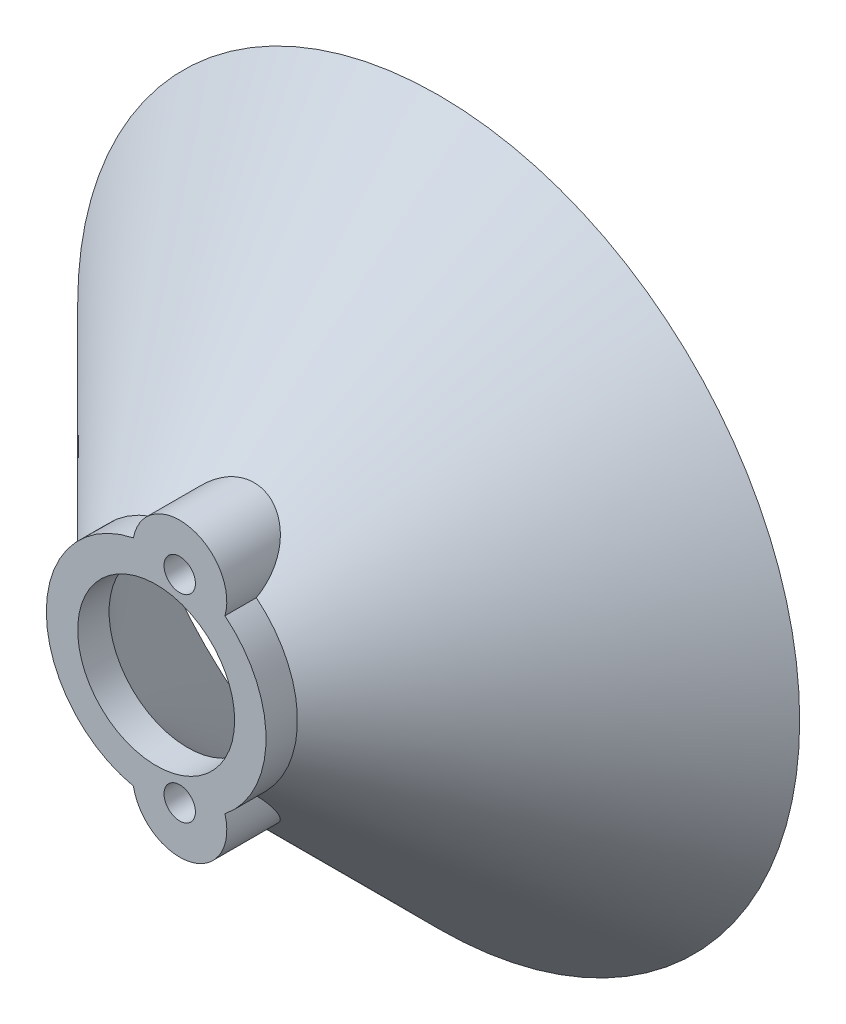
ISO-10303-21;
HEADER;
FILE_DESCRIPTION(('STEP AP214'),'2;1');
FILE_NAME('part.step','',(''),(''),'','','');
FILE_SCHEMA(('AUTOMOTIVE_DESIGN { 1 0 10303 214 1 1 1 1 }'));
ENDSEC;
DATA;
#1=APPLICATION_CONTEXT('core data for automotive mechanical design processes');
#2=APPLICATION_PROTOCOL_DEFINITION('international standard','automotive_design',2000,#1);
#3=PRODUCT_CONTEXT('',#1,'mechanical');
#4=PRODUCT('Part','Part','',(#3));
#5=PRODUCT_RELATED_PRODUCT_CATEGORY('part','',(#4));
#6=PRODUCT_DEFINITION_FORMATION('','',#4);
#7=PRODUCT_DEFINITION_CONTEXT('part definition',#1,'design');
#8=PRODUCT_DEFINITION('design','',#6,#7);
#9=PRODUCT_DEFINITION_SHAPE('','',#8);
#10=(LENGTH_UNIT() NAMED_UNIT(*) SI_UNIT(.MILLI.,.METRE.));
#11=(NAMED_UNIT(*) PLANE_ANGLE_UNIT() SI_UNIT($,.RADIAN.));
#12=(NAMED_UNIT(*) SI_UNIT($,.STERADIAN.) SOLID_ANGLE_UNIT());
#13=UNCERTAINTY_MEASURE_WITH_UNIT(LENGTH_MEASURE(1.E-05),#10,'distance_accuracy_value','');
#14=(GEOMETRIC_REPRESENTATION_CONTEXT(3) GLOBAL_UNCERTAINTY_ASSIGNED_CONTEXT((#13)) GLOBAL_UNIT_ASSIGNED_CONTEXT((#10,
#11,#12)) REPRESENTATION_CONTEXT('',''));
#15=CARTESIAN_POINT('',(0.,0.,0.));
#16=DIRECTION('',(0.,0.,1.));
#17=DIRECTION('',(1.,0.,0.));
#18=AXIS2_PLACEMENT_3D('',#15,#16,#17);
#19=CARTESIAN_POINT('',(0.,0.,0.));
#20=DIRECTION('',(0.,0.,-1.));
#21=DIRECTION('',(-1.,0.,0.));
#22=AXIS2_PLACEMENT_3D('',#19,#20,#21);
#23=CONICAL_SURFACE('',#22,7.,0.78539816339745);
#24=CARTESIAN_POINT('',(0.,0.,-16.));
#25=DIRECTION('',(0.,0.,-1.));
#26=DIRECTION('',(-1.,0.,0.));
#27=AXIS2_PLACEMENT_3D('',#24,#25,#26);
#28=CIRCLE('',#27,23.0000000000001);
#29=CARTESIAN_POINT('',(-23.0000000000001,0.,-16.));
#30=VERTEX_POINT('',#29);
#31=EDGE_CURVE('E102',#30,#30,#28,.T.);
#32=ORIENTED_EDGE('',*,*,#31,.F.);
#33=EDGE_LOOP('',(#32));
#34=FACE_BOUND('',#33,.T.);
#35=CARTESIAN_POINT('',(4.38002597349473,-5.46008905710443,0.000200000000000384));
#36=CARTESIAN_POINT('',(4.40600004241989,-5.54920340052367,-0.0855735072586875));
#37=CARTESIAN_POINT('',(4.42804720668429,-5.64015158060134,-0.170573019301104));
#38=CARTESIAN_POINT('',(4.46373156243864,-5.82541331378191,-0.338834548684181));
#39=CARTESIAN_POINT('',(4.47736020927237,-5.91973018370654,-0.422094718102266));
#40=CARTESIAN_POINT('',(4.50483032614621,-6.20821871731188,-0.669766796828437));
#41=CARTESIAN_POINT('',(4.50491016461,-6.40678511714898,-0.830972203219254));
#42=CARTESIAN_POINT('',(4.46657070170104,-6.77833912474665,-1.11689781061202));
#43=CARTESIAN_POINT('',(4.43407197051871,-6.95056258230079,-1.24341577278359));
#44=CARTESIAN_POINT('',(4.33622760977159,-7.29371341657828,-1.48433222475109));
#45=CARTESIAN_POINT('',(4.27098547345163,-7.46464316515868,-1.59876753377278));
#46=CARTESIAN_POINT('',(4.12011987313716,-7.7691888413267,-1.79317153275031));
#47=CARTESIAN_POINT('',(4.04019795731339,-7.90402735788128,-1.87564856951719));
#48=CARTESIAN_POINT('',(3.85583362622914,-8.16423945592623,-2.02788497016604));
#49=CARTESIAN_POINT('',(3.75138542533433,-8.28961079491795,-2.09764132639132));
#50=CARTESIAN_POINT('',(3.57661134385553,-8.46672109107776,-2.19083795873603));
#51=CARTESIAN_POINT('',(3.51501332465714,-8.52417001946999,-2.22010410686948));
#52=CARTESIAN_POINT('',(3.38610587234105,-8.63447769938692,-2.27434472781031));
#53=CARTESIAN_POINT('',(3.31879952176245,-8.68733889750408,-2.29932149514647));
#54=CARTESIAN_POINT('',(3.17889681833493,-8.78771190510562,-2.34464423629331));
#55=CARTESIAN_POINT('',(3.10630343953184,-8.83522668433991,-2.36499278739758));
#56=CARTESIAN_POINT('',(2.95639904464545,-8.92421645310571,-2.40077876534268));
#57=CARTESIAN_POINT('',(2.87908890558933,-8.96569256063118,-2.41621710188451));
#58=CARTESIAN_POINT('',(2.66343950837689,-9.06932965289546,-2.45115778519646));
#59=CARTESIAN_POINT('',(2.52105506908791,-9.12502388576103,-2.46564881276383));
#60=CARTESIAN_POINT('',(2.22890132845023,-9.21410954968719,-2.47863531086376));
#61=CARTESIAN_POINT('',(2.0791361088564,-9.24751316263255,-2.47713952585163));
#62=CARTESIAN_POINT('',(1.78976111685691,-9.28925137819928,-2.45906527162721));
#63=CARTESIAN_POINT('',(1.65033309070723,-9.29942713131322,-2.44374154791665));
#64=CARTESIAN_POINT('',(1.37343211126622,-9.30052580312172,-2.4003929548129));
#65=CARTESIAN_POINT('',(1.23595913795875,-9.29144891907078,-2.37236821555132));
#66=CARTESIAN_POINT('',(0.963105849150731,-9.25485367562386,-2.30385237811956));
#67=CARTESIAN_POINT('',(0.827859131005005,-9.22688933777565,-2.2630729159767));
#68=CARTESIAN_POINT('',(0.565903724817107,-9.15411423013197,-2.17069682977966));
#69=CARTESIAN_POINT('',(0.439198035716614,-9.10929757908265,-2.11909643213356));
#70=CARTESIAN_POINT('',(0.183038793061871,-8.99946382533734,-2.00034739921533));
#71=CARTESIAN_POINT('',(0.0548124958313647,-8.9327684451456,-1.93211342821813));
#72=CARTESIAN_POINT('',(-0.186866027815897,-8.78487170433603,-1.78601882591699));
#73=CARTESIAN_POINT('',(-0.300311747484901,-8.70366399211608,-1.70815398408929));
#74=CARTESIAN_POINT('',(-0.529508925353116,-8.5151030087253,-1.53058702217918));
#75=CARTESIAN_POINT('',(-0.642393346876825,-8.40565112725254,-1.42942037522782));
#76=CARTESIAN_POINT('',(-0.846543799339141,-8.17548481184044,-1.21843242396596));
#77=CARTESIAN_POINT('',(-0.937789542067368,-8.05475995509113,-1.10860312517311));
#78=CARTESIAN_POINT('',(-1.11551994199878,-7.78020343155664,-0.858918690071136));
#79=CARTESIAN_POINT('',(-1.19718782305958,-7.62466072336668,-0.717526023537838));
#80=CARTESIAN_POINT('',(-1.33080994336098,-7.30798599419755,-0.427595657233578));
#81=CARTESIAN_POINT('',(-1.38278848964671,-7.14685866040406,-0.27906391065735));
#82=CARTESIAN_POINT('',(-1.43144177887967,-6.9394076476627,-0.085481475619611));
#83=CARTESIAN_POINT('',(-1.44102423021849,-6.89374547135443,-0.0427271057538026));
#84=CARTESIAN_POINT('',(-1.44951095060491,-6.84807403903291,0.000199999999995933));
#85=B_SPLINE_CURVE_WITH_KNOTS('',3,(#35,#36,#37,#38,#39,#40,#41,#42,#43,#44,#45,#46,#47,#48,#49,
#50,#51,#52,#53,#54,#55,#56,#57,#58,#59,#60,#61,#62,#63,#64,#65,#66,#67,#68,#69,#70,#71,#72,#73,
#74,#75,#76,#77,#78,#79,#80,#81,#82,#83,#84),.UNSPECIFIED.,.F.,.F.,(4,2,2,2,2,2,2,2,2,2,2,2,2,2,
2,2,2,2,2,2,2,2,2,2,4),(0.,0.378981692897977,0.758347416609259,1.52189881712999,
2.16799039121961,2.81205258173702,3.34137513139237,3.87082267138723,4.13799517974665,
4.40502432066171,4.67190439621682,4.93873499884537,5.39671380462983,5.85444211831994,
6.27440057932098,6.69435473762349,7.12458868870498,7.55497292580066,8.03263742434803,
8.51051149628236,9.06936586228223,9.62874215110698,10.3028721451866,10.9764494262305,
11.1662508129107),.UNSPECIFIED.);
#86=CARTESIAN_POINT('',(4.38008656456496,-5.46029684970675,0.));
#87=VERTEX_POINT('',#86);
#88=CARTESIAN_POINT('',(-1.44947140004422,-6.84828684128037,0.));
#89=VERTEX_POINT('',#88);
#90=EDGE_CURVE('E96',#87,#89,#85,.T.);
#91=ORIENTED_EDGE('',*,*,#90,.T.);
#92=CARTESIAN_POINT('',(0.,0.,0.));
#93=DIRECTION('',(0.,0.,1.));
#94=DIRECTION('',(1.,0.,0.));
#95=AXIS2_PLACEMENT_3D('',#92,#93,#94);
#96=CIRCLE('',#95,7.);
#97=CARTESIAN_POINT('',(-1.44947140004422,6.84828684128037,0.));
#98=VERTEX_POINT('',#97);
#99=EDGE_CURVE('E101',#98,#89,#96,.T.);
#100=ORIENTED_EDGE('',*,*,#99,.F.);
#101=CARTESIAN_POINT('',(-1.46068853435402,5.81593037428005,1.00344623030309));
#102=CARTESIAN_POINT('',(-1.47439258893566,5.89980230451008,0.918754293343235));
#103=CARTESIAN_POINT('',(-1.48457107664434,5.98438697027109,0.834234476532002));
#104=CARTESIAN_POINT('',(-1.49769797558791,6.15468245102708,0.665728119425346));
#105=CARTESIAN_POINT('',(-1.50064453606695,6.24039354865158,0.581741721123194));
#106=CARTESIAN_POINT('',(-1.49835350226193,6.49942447887601,0.330230025445846));
#107=CARTESIAN_POINT('',(-1.48186689806502,6.67393284776749,0.163866411539599));
#108=CARTESIAN_POINT('',(-1.4154360877965,7.03146651143603,-0.17216121817867));
#109=CARTESIAN_POINT('',(-1.36376097067543,7.21445175718274,-0.341531043027554));
#110=CARTESIAN_POINT('',(-1.22295331597393,7.57384065922986,-0.671286259634839));
#111=CARTESIAN_POINT('',(-1.13387623059536,7.75025363973727,-0.831684555268082));
#112=CARTESIAN_POINT('',(-0.932816312805183,8.06370721455375,-1.1167380830692));
#113=CARTESIAN_POINT('',(-0.826321288113327,8.20267120676445,-1.24313378762426));
#114=CARTESIAN_POINT('',(-0.584396116892566,8.4649536698036,-1.48408482404702));
#115=CARTESIAN_POINT('',(-0.448993718560591,8.58828696488269,-1.59865135537137));
#116=CARTESIAN_POINT('',(-0.176881093347268,8.79231258803561,-1.79319185777498));
#117=CARTESIAN_POINT('',(-0.0447361057830059,8.8766861460113,-1.87568800932243));
#118=CARTESIAN_POINT('',(0.237117971896833,9.02588685765781,-2.02791863530474));
#119=CARTESIAN_POINT('',(0.386822795027332,9.09071874628065,-2.09765619953672));
#120=CARTESIAN_POINT('',(0.622616776333805,9.17005102231931,-2.19083650385061));
#121=CARTESIAN_POINT('',(0.703490802948499,9.19357622438534,-2.22010142457082));
#122=CARTESIAN_POINT('',(0.868268688094588,9.23395576285823,-2.27433998430051));
#123=CARTESIAN_POINT('',(0.952170898837717,9.25081366929214,-2.29931591579964));
#124=CARTESIAN_POINT('',(1.12229464408929,9.27737205521736,-2.34463949696494));
#125=CARTESIAN_POINT('',(1.20851507579307,9.28707587766781,-2.36498930524657));
#126=CARTESIAN_POINT('',(1.3824457740388,9.29896513194352,-2.40077736020406));
#127=CARTESIAN_POINT('',(1.47015576145197,9.30115195709667,-2.416216516622));
#128=CARTESIAN_POINT('',(1.70937499840626,9.29648803662721,-2.45115789677618));
#129=CARTESIAN_POINT('',(1.86158117032906,9.28204169962075,-2.46564895848012));
#130=CARTESIAN_POINT('',(2.16253380738596,9.22991131908573,-2.47863529656449));
#131=CARTESIAN_POINT('',(2.31128215244337,9.1922402240667,-2.47713947853104));
#132=CARTESIAN_POINT('',(2.58841671405525,9.09909527813799,-2.4590652680131));
#133=CARTESIAN_POINT('',(2.71747034225015,9.04534681495937,-2.44374153571449));
#134=CARTESIAN_POINT('',(2.96515601829704,8.92154388729629,-2.4003929325333));
#135=CARTESIAN_POINT('',(3.08378818116866,8.85148960280709,-2.37236820185015));
#136=CARTESIAN_POINT('',(3.31087380079483,8.69586135203315,-2.30385240908336));
#137=CARTESIAN_POINT('',(3.41900702415282,8.60994947116486,-2.26307298924421));
#138=CARTESIAN_POINT('',(3.6200600037911,8.42693429555101,-2.17069692041721));
#139=CARTESIAN_POINT('',(3.71297440556866,8.32982708229089,-2.11909647872136));
#140=CARTESIAN_POINT('',(3.89215317271071,8.11634112896855,-2.00034724312917));
#141=CARTESIAN_POINT('',(3.97656562066453,7.99901722268328,-1.93211309364306));
#142=CARTESIAN_POINT('',(4.12566411463988,7.75807823906366,-1.78601841189554));
#143=CARTESIAN_POINT('',(4.19034159076706,7.63446045573037,-1.70815371814611));
#144=CARTESIAN_POINT('',(4.309972101223,7.36284726483827,-1.53058822541584));
#145=CARTESIAN_POINT('',(4.36142026976304,7.21427051885659,-1.42942304446289));
#146=CARTESIAN_POINT('',(4.43994352703065,6.91680040232332,-1.21843477661552));
#147=CARTESIAN_POINT('',(4.46699522687155,6.76790686481391,-1.10860349097039));
#148=CARTESIAN_POINT('',(4.50193071322984,6.44270732297609,-0.858912462604447));
#149=CARTESIAN_POINT('',(4.50474227010162,6.26704564288345,-0.71751550451562));
#150=CARTESIAN_POINT('',(4.48131286834933,5.92412198027988,-0.427574622868321));
#151=CARTESIAN_POINT('',(4.45509887989909,5.75685235082999,-0.279037456488061));
#152=CARTESIAN_POINT('',(4.4050570904833,5.54977458108781,-0.0854890951682216));
#153=CARTESIAN_POINT('',(4.39303770265286,5.50470540318252,-0.0427448771831622));
#154=CARTESIAN_POINT('',(4.34699937234609,5.34684305855434,0.109203447123938));
#155=CARTESIAN_POINT('',(4.30758882524441,5.23655830832694,0.21945943509701));
#156=CARTESIAN_POINT('',(4.21699869201045,5.02272966460625,0.441815660450446));
#157=CARTESIAN_POINT('',(4.16580721991221,4.91919271537603,0.55391765352031));
#158=CARTESIAN_POINT('',(4.05200738181153,4.71864385770806,0.780366028718059));
#159=CARTESIAN_POINT('',(3.98929411420278,4.62170414568599,0.894723625812897));
#160=CARTESIAN_POINT('',(3.85357805000762,4.43617935126151,1.12379495991822));
#161=CARTESIAN_POINT('',(3.78058958993838,4.34758291052815,1.23850798654678));
#162=CARTESIAN_POINT('',(3.70277215392269,4.26338642892089,1.35314375371913));
#163=B_SPLINE_CURVE_WITH_KNOTS('',3,(#101,#102,#103,#104,#105,#106,#107,#108,#109,#110,#111,
#112,#113,#114,#115,#116,#117,#118,#119,#120,#121,#122,#123,#124,#125,#126,#127,#128,#129,#130,
#131,#132,#133,#134,#135,#136,#137,#138,#139,#140,#141,#142,#143,#144,#145,#146,#147,#148,#149,
#150,#151,#152,#153,#154,#155,#156,#157,#158,#159,#160,#161,#162),.UNSPECIFIED.,.F.,.F.,(4,2,2,
2,2,2,2,2,2,2,2,2,2,2,2,2,2,2,2,2,2,2,2,2,2,2,2,2,2,2,4),(0.,0.359827111436056,
0.719746298290435,1.44260385671945,2.20386334892954,2.9639981600687,3.60938324247208,
4.25415158279092,4.78360085002196,5.3129217282307,5.58008203778968,5.84709910111127,
6.11399131352523,6.38083405293747,6.83881516663828,7.29654117254867,7.71649979997773,
8.13645379182483,8.56668736233241,8.99707198010078,9.474737699315,9.95261055021539,
10.5114582789765,11.0708412070828,11.7450077901627,12.4185484713751,12.6083388077533,
13.0901853022959,13.5725200875294,14.0594860832427,14.545779249703),.UNSPECIFIED.);
#164=CARTESIAN_POINT('',(4.38008656456496,5.46029684970676,0.));
#165=VERTEX_POINT('',#164);
#166=EDGE_CURVE('E99',#98,#165,#163,.T.);
#167=ORIENTED_EDGE('',*,*,#166,.T.);
#168=CARTESIAN_POINT('',(0.,0.,0.));
#169=DIRECTION('',(0.,0.,1.));
#170=DIRECTION('',(1.,0.,0.));
#171=AXIS2_PLACEMENT_3D('',#168,#169,#170);
#172=CIRCLE('',#171,7.);
#173=EDGE_CURVE('E87',#87,#165,#172,.T.);
#174=ORIENTED_EDGE('',*,*,#173,.F.);
#175=EDGE_LOOP('',(#91,#100,#167,#174));
#176=FACE_BOUND('',#175,.T.);
#177=ADVANCED_FACE('F47',(#34,#176),#23,.T.);
#178=CARTESIAN_POINT('',(1.5,-6.3,2.));
#179=DIRECTION('',(0.,0.,-1.));
#180=DIRECTION('',(-1.,0.,0.));
#181=AXIS2_PLACEMENT_3D('',#178,#179,#180);
#182=CYLINDRICAL_SURFACE('',#181,3.);
#183=DIRECTION('',(0.,0.,-1.));
#184=VECTOR('',#183,1.);
#185=CARTESIAN_POINT('',(-1.44947140004422,-6.84828684128037,2.));
#186=LINE('',#185,#184);
#187=CARTESIAN_POINT('',(-1.44947140004422,-6.84828684128037,2.));
#188=VERTEX_POINT('',#187);
#189=EDGE_CURVE('E105',#188,#89,#186,.T.);
#190=ORIENTED_EDGE('',*,*,#189,.T.);
#191=ORIENTED_EDGE('',*,*,#90,.F.);
#192=DIRECTION('',(0.,0.,-1.));
#193=VECTOR('',#192,1.);
#194=CARTESIAN_POINT('',(4.38008656456496,-5.46029684970675,2.));
#195=LINE('',#194,#193);
#196=CARTESIAN_POINT('',(4.38008656456496,-5.46029684970675,2.));
#197=VERTEX_POINT('',#196);
#198=EDGE_CURVE('E11',#197,#87,#195,.T.);
#199=ORIENTED_EDGE('',*,*,#198,.F.);
#200=CARTESIAN_POINT('',(1.5,-6.3,2.));
#201=DIRECTION('',(0.,0.,1.));
#202=DIRECTION('',(1.,0.,0.));
#203=AXIS2_PLACEMENT_3D('',#200,#201,#202);
#204=CIRCLE('',#203,3.);
#205=EDGE_CURVE('E289',#188,#197,#204,.T.);
#206=ORIENTED_EDGE('',*,*,#205,.F.);
#207=EDGE_LOOP('',(#190,#191,#199,#206));
#208=FACE_BOUND('',#207,.T.);
#209=ADVANCED_FACE('F49',(#208),#182,.T.);
#210=CARTESIAN_POINT('',(0.,0.,2.));
#211=DIRECTION('',(0.,0.,-1.));
#212=DIRECTION('',(-1.,0.,0.));
#213=AXIS2_PLACEMENT_3D('',#210,#211,#212);
#214=CYLINDRICAL_SURFACE('',#213,7.);
#215=ORIENTED_EDGE('',*,*,#173,.T.);
#216=DIRECTION('',(0.,0.,-1.));
#217=VECTOR('',#216,1.);
#218=CARTESIAN_POINT('',(4.38008656456496,5.46029684970676,2.));
#219=LINE('',#218,#217);
#220=CARTESIAN_POINT('',(4.38008656456496,5.46029684970676,2.));
#221=VERTEX_POINT('',#220);
#222=EDGE_CURVE('E57',#221,#165,#219,.T.);
#223=ORIENTED_EDGE('',*,*,#222,.F.);
#224=CARTESIAN_POINT('',(0.,0.,2.));
#225=DIRECTION('',(0.,0.,1.));
#226=DIRECTION('',(1.,0.,0.));
#227=AXIS2_PLACEMENT_3D('',#224,#225,#226);
#228=CIRCLE('',#227,7.);
#229=EDGE_CURVE('E89',#197,#221,#228,.T.);
#230=ORIENTED_EDGE('',*,*,#229,.F.);
#231=ORIENTED_EDGE('',*,*,#198,.T.);
#232=EDGE_LOOP('',(#215,#223,#230,#231));
#233=FACE_BOUND('',#232,.T.);
#234=ADVANCED_FACE('F85',(#233),#214,.T.);
#235=CARTESIAN_POINT('',(1.5,6.3,2.));
#236=DIRECTION('',(0.,0.,-1.));
#237=DIRECTION('',(-1.,0.,0.));
#238=AXIS2_PLACEMENT_3D('',#235,#236,#237);
#239=CYLINDRICAL_SURFACE('',#238,3.);
#240=ORIENTED_EDGE('',*,*,#222,.T.);
#241=ORIENTED_EDGE('',*,*,#166,.F.);
#242=DIRECTION('',(0.,0.,-1.));
#243=VECTOR('',#242,1.);
#244=CARTESIAN_POINT('',(-1.44947140004422,6.84828684128037,2.));
#245=LINE('',#244,#243);
#246=CARTESIAN_POINT('',(-1.44947140004422,6.84828684128037,2.));
#247=VERTEX_POINT('',#246);
#248=EDGE_CURVE('E301',#247,#98,#245,.T.);
#249=ORIENTED_EDGE('',*,*,#248,.F.);
#250=CARTESIAN_POINT('',(1.5,6.3,2.));
#251=DIRECTION('',(0.,0.,1.));
#252=DIRECTION('',(1.,0.,0.));
#253=AXIS2_PLACEMENT_3D('',#250,#251,#252);
#254=CIRCLE('',#253,3.);
#255=EDGE_CURVE('E307',#221,#247,#254,.T.);
#256=ORIENTED_EDGE('',*,*,#255,.F.);
#257=EDGE_LOOP('',(#240,#241,#249,#256));
#258=FACE_BOUND('',#257,.T.);
#259=ADVANCED_FACE('F160',(#258),#239,.T.);
#260=CARTESIAN_POINT('',(1.5,-6.3,2.));
#261=DIRECTION('',(0.,0.,-1.));
#262=DIRECTION('',(-1.,0.,0.));
#263=AXIS2_PLACEMENT_3D('',#260,#261,#262);
#264=CYLINDRICAL_SURFACE('',#263,1.);
#265=CARTESIAN_POINT('',(1.5,-6.3,0.));
#266=DIRECTION('',(0.,0.,1.));
#267=DIRECTION('',(1.,0.,0.));
#268=AXIS2_PLACEMENT_3D('',#265,#266,#267);
#269=CIRCLE('',#268,1.);
#270=CARTESIAN_POINT('',(2.5,-6.3,0.));
#271=VERTEX_POINT('',#270);
#272=EDGE_CURVE('E290',#271,#271,#269,.T.);
#273=ORIENTED_EDGE('',*,*,#272,.F.);
#274=EDGE_LOOP('',(#273));
#275=FACE_BOUND('',#274,.T.);
#276=CARTESIAN_POINT('',(1.5,-6.3,2.));
#277=DIRECTION('',(0.,0.,1.));
#278=DIRECTION('',(1.,0.,0.));
#279=AXIS2_PLACEMENT_3D('',#276,#277,#278);
#280=CIRCLE('',#279,1.);
#281=CARTESIAN_POINT('',(2.5,-6.3,2.));
#282=VERTEX_POINT('',#281);
#283=EDGE_CURVE('E319',#282,#282,#280,.T.);
#284=ORIENTED_EDGE('',*,*,#283,.T.);
#285=EDGE_LOOP('',(#284));
#286=FACE_BOUND('',#285,.T.);
#287=ADVANCED_FACE('F156',(#275,#286),#264,.F.);
#288=CARTESIAN_POINT('',(0.,0.,2.));
#289=DIRECTION('',(0.,0.,-1.));
#290=DIRECTION('',(-1.,0.,0.));
#291=AXIS2_PLACEMENT_3D('',#288,#289,#290);
#292=CYLINDRICAL_SURFACE('',#291,5.);
#293=CARTESIAN_POINT('',(0.,0.,2.));
#294=DIRECTION('',(0.,0.,1.));
#295=DIRECTION('',(1.,0.,0.));
#296=AXIS2_PLACEMENT_3D('',#293,#294,#295);
#297=CIRCLE('',#296,5.);
#298=CARTESIAN_POINT('',(5.,0.,2.));
#299=VERTEX_POINT('',#298);
#300=EDGE_CURVE('E312',#299,#299,#297,.T.);
#301=ORIENTED_EDGE('',*,*,#300,.T.);
#302=EDGE_LOOP('',(#301));
#303=FACE_BOUND('',#302,.T.);
#304=CARTESIAN_POINT('',(0.,0.,0.));
#305=DIRECTION('',(0.,0.,1.));
#306=DIRECTION('',(1.,0.,0.));
#307=AXIS2_PLACEMENT_3D('',#304,#305,#306);
#308=CIRCLE('',#307,5.);
#309=CARTESIAN_POINT('',(5.,0.,0.));
#310=VERTEX_POINT('',#309);
#311=EDGE_CURVE('E107',#310,#310,#308,.T.);
#312=ORIENTED_EDGE('',*,*,#311,.F.);
#313=EDGE_LOOP('',(#312));
#314=FACE_BOUND('',#313,.T.);
#315=ADVANCED_FACE('F159',(#303,#314),#292,.F.);
#316=CARTESIAN_POINT('',(0.,0.,2.));
#317=DIRECTION('',(0.,0.,-1.));
#318=DIRECTION('',(-1.,0.,0.));
#319=AXIS2_PLACEMENT_3D('',#316,#317,#318);
#320=CYLINDRICAL_SURFACE('',#319,7.);
#321=ORIENTED_EDGE('',*,*,#99,.T.);
#322=ORIENTED_EDGE('',*,*,#189,.F.);
#323=CARTESIAN_POINT('',(0.,0.,2.));
#324=DIRECTION('',(0.,0.,1.));
#325=DIRECTION('',(1.,0.,0.));
#326=AXIS2_PLACEMENT_3D('',#323,#324,#325);
#327=CIRCLE('',#326,7.);
#328=EDGE_CURVE('E64',#247,#188,#327,.T.);
#329=ORIENTED_EDGE('',*,*,#328,.F.);
#330=ORIENTED_EDGE('',*,*,#248,.T.);
#331=EDGE_LOOP('',(#321,#322,#329,#330));
#332=FACE_BOUND('',#331,.T.);
#333=ADVANCED_FACE('F154',(#332),#320,.T.);
#334=CARTESIAN_POINT('',(1.5,6.3,2.));
#335=DIRECTION('',(0.,0.,-1.));
#336=DIRECTION('',(-1.,0.,0.));
#337=AXIS2_PLACEMENT_3D('',#334,#335,#336);
#338=CYLINDRICAL_SURFACE('',#337,1.);
#339=CARTESIAN_POINT('',(1.5,6.3,0.));
#340=DIRECTION('',(0.,0.,1.));
#341=DIRECTION('',(1.,0.,0.));
#342=AXIS2_PLACEMENT_3D('',#339,#340,#341);
#343=CIRCLE('',#342,1.);
#344=CARTESIAN_POINT('',(2.5,6.3,0.));
#345=VERTEX_POINT('',#344);
#346=EDGE_CURVE('E287',#345,#345,#343,.T.);
#347=ORIENTED_EDGE('',*,*,#346,.F.);
#348=EDGE_LOOP('',(#347));
#349=FACE_BOUND('',#348,.T.);
#350=CARTESIAN_POINT('',(1.5,6.3,2.));
#351=DIRECTION('',(0.,0.,1.));
#352=DIRECTION('',(1.,0.,0.));
#353=AXIS2_PLACEMENT_3D('',#350,#351,#352);
#354=CIRCLE('',#353,1.);
#355=CARTESIAN_POINT('',(2.5,6.3,2.));
#356=VERTEX_POINT('',#355);
#357=EDGE_CURVE('E302',#356,#356,#354,.T.);
#358=ORIENTED_EDGE('',*,*,#357,.T.);
#359=EDGE_LOOP('',(#358));
#360=FACE_BOUND('',#359,.T.);
#361=ADVANCED_FACE('F151',(#349,#360),#338,.F.);
#362=CARTESIAN_POINT('',(0.,0.,2.));
#363=DIRECTION('',(0.,0.,1.));
#364=DIRECTION('',(1.,0.,0.));
#365=AXIS2_PLACEMENT_3D('',#362,#363,#364);
#366=PLANE('',#365);
#367=ORIENTED_EDGE('',*,*,#205,.T.);
#368=ORIENTED_EDGE('',*,*,#229,.T.);
#369=ORIENTED_EDGE('',*,*,#255,.T.);
#370=ORIENTED_EDGE('',*,*,#328,.T.);
#371=EDGE_LOOP('',(#367,#368,#369,#370));
#372=FACE_BOUND('',#371,.T.);
#373=ORIENTED_EDGE('',*,*,#300,.F.);
#374=EDGE_LOOP('',(#373));
#375=FACE_BOUND('',#374,.T.);
#376=ORIENTED_EDGE('',*,*,#283,.F.);
#377=EDGE_LOOP('',(#376));
#378=FACE_BOUND('',#377,.T.);
#379=ORIENTED_EDGE('',*,*,#357,.F.);
#380=EDGE_LOOP('',(#379));
#381=FACE_BOUND('',#380,.T.);
#382=ADVANCED_FACE('F141',(#372,#375,#378,#381),#366,.T.);
#383=CARTESIAN_POINT('',(0.,0.,-16.));
#384=DIRECTION('',(0.,0.,-1.));
#385=DIRECTION('',(-1.,0.,0.));
#386=AXIS2_PLACEMENT_3D('',#383,#384,#385);
#387=PLANE('',#386);
#388=CARTESIAN_POINT('',(0.,0.,-16.));
#389=DIRECTION('',(0.,0.,1.));
#390=DIRECTION('',(1.,0.,0.));
#391=AXIS2_PLACEMENT_3D('',#388,#389,#390);
#392=CIRCLE('',#391,21.0000000000001);
#393=CARTESIAN_POINT('',(21.0000000000001,0.,-16.));
#394=VERTEX_POINT('',#393);
#395=EDGE_CURVE('E112',#394,#394,#392,.T.);
#396=ORIENTED_EDGE('',*,*,#395,.T.);
#397=EDGE_LOOP('',(#396));
#398=FACE_BOUND('',#397,.T.);
#399=ORIENTED_EDGE('',*,*,#31,.T.);
#400=EDGE_LOOP('',(#399));
#401=FACE_BOUND('',#400,.T.);
#402=ADVANCED_FACE('F137',(#398,#401),#387,.T.);
#403=CARTESIAN_POINT('',(0.,0.,0.));
#404=DIRECTION('',(0.,0.,-1.));
#405=DIRECTION('',(-1.,0.,0.));
#406=AXIS2_PLACEMENT_3D('',#403,#404,#405);
#407=PLANE('',#406);
#408=ORIENTED_EDGE('',*,*,#346,.T.);
#409=EDGE_LOOP('',(#408));
#410=FACE_BOUND('',#409,.T.);
#411=ADVANCED_FACE('F140',(#410),#407,.F.);
#412=ORIENTED_EDGE('',*,*,#272,.T.);
#413=EDGE_LOOP('',(#412));
#414=FACE_BOUND('',#413,.T.);
#415=ADVANCED_FACE('F135',(#414),#407,.F.);
#416=CARTESIAN_POINT('',(0.,0.,0.));
#417=DIRECTION('',(0.,0.,-1.));
#418=DIRECTION('',(1.,0.,0.));
#419=AXIS2_PLACEMENT_3D('',#416,#417,#418);
#420=CONICAL_SURFACE('',#419,5.,0.78539816339745);
#421=CARTESIAN_POINT('',(21.0000000000001,0.,-16.));
#422=CARTESIAN_POINT('',(20.8333333333334,0.,-15.8333333333333));
#423=CARTESIAN_POINT('',(20.6666666666667,0.,-15.6666666666667));
#424=CARTESIAN_POINT('',(20.3333333333334,0.,-15.3333333333333));
#425=CARTESIAN_POINT('',(20.1666666666667,0.,-15.1666666666667));
#426=CARTESIAN_POINT('',(19.8333333333334,0.,-14.8333333333333));
#427=CARTESIAN_POINT('',(19.6666666666667,0.,-14.6666666666667));
#428=CARTESIAN_POINT('',(19.3333333333334,0.,-14.3333333333333));
#429=CARTESIAN_POINT('',(19.1666666666667,0.,-14.1666666666667));
#430=CARTESIAN_POINT('',(18.8333333333334,0.,-13.8333333333333));
#431=CARTESIAN_POINT('',(18.6666666666667,0.,-13.6666666666667));
#432=CARTESIAN_POINT('',(18.3333333333334,0.,-13.3333333333333));
#433=CARTESIAN_POINT('',(18.1666666666667,0.,-13.1666666666667));
#434=CARTESIAN_POINT('',(17.8333333333334,0.,-12.8333333333333));
#435=CARTESIAN_POINT('',(17.6666666666667,0.,-12.6666666666667));
#436=CARTESIAN_POINT('',(17.3333333333334,0.,-12.3333333333333));
#437=CARTESIAN_POINT('',(17.1666666666667,0.,-12.1666666666667));
#438=CARTESIAN_POINT('',(16.8333333333334,0.,-11.8333333333333));
#439=CARTESIAN_POINT('',(16.6666666666667,0.,-11.6666666666667));
#440=CARTESIAN_POINT('',(16.3333333333334,0.,-11.3333333333333));
#441=CARTESIAN_POINT('',(16.1666666666667,0.,-11.1666666666667));
#442=CARTESIAN_POINT('',(15.8333333333334,0.,-10.8333333333333));
#443=CARTESIAN_POINT('',(15.6666666666667,0.,-10.6666666666667));
#444=CARTESIAN_POINT('',(15.3333333333334,0.,-10.3333333333333));
#445=CARTESIAN_POINT('',(15.1666666666667,0.,-10.1666666666667));
#446=CARTESIAN_POINT('',(14.8333333333334,0.,-9.83333333333333));
#447=CARTESIAN_POINT('',(14.6666666666667,0.,-9.66666666666667));
#448=CARTESIAN_POINT('',(14.3333333333334,0.,-9.33333333333333));
#449=CARTESIAN_POINT('',(14.1666666666667,0.,-9.16666666666667));
#450=CARTESIAN_POINT('',(13.8333333333334,0.,-8.83333333333333));
#451=CARTESIAN_POINT('',(13.6666666666667,0.,-8.66666666666667));
#452=CARTESIAN_POINT('',(13.3333333333334,0.,-8.33333333333333));
#453=CARTESIAN_POINT('',(13.1666666666667,0.,-8.16666666666667));
#454=CARTESIAN_POINT('',(12.8333333333334,0.,-7.83333333333333));
#455=CARTESIAN_POINT('',(12.6666666666667,0.,-7.66666666666667));
#456=CARTESIAN_POINT('',(12.3333333333334,0.,-7.33333333333333));
#457=CARTESIAN_POINT('',(12.1666666666667,0.,-7.16666666666667));
#458=CARTESIAN_POINT('',(11.8333333333334,0.,-6.83333333333333));
#459=CARTESIAN_POINT('',(11.6666666666667,0.,-6.66666666666667));
#460=CARTESIAN_POINT('',(11.3333333333334,0.,-6.33333333333333));
#461=CARTESIAN_POINT('',(11.1666666666667,0.,-6.16666666666667));
#462=CARTESIAN_POINT('',(10.8333333333334,0.,-5.83333333333333));
#463=CARTESIAN_POINT('',(10.6666666666667,0.,-5.66666666666667));
#464=CARTESIAN_POINT('',(10.3333333333334,0.,-5.33333333333333));
#465=CARTESIAN_POINT('',(10.1666666666667,0.,-5.16666666666667));
#466=CARTESIAN_POINT('',(9.83333333333335,0.,-4.83333333333333));
#467=CARTESIAN_POINT('',(9.66666666666668,0.,-4.66666666666667));
#468=CARTESIAN_POINT('',(9.33333333333335,0.,-4.33333333333333));
#469=CARTESIAN_POINT('',(9.16666666666668,0.,-4.16666666666667));
#470=CARTESIAN_POINT('',(8.83333333333335,0.,-3.83333333333333));
#471=CARTESIAN_POINT('',(8.66666666666668,0.,-3.66666666666667));
#472=CARTESIAN_POINT('',(8.33333333333334,0.,-3.33333333333333));
#473=CARTESIAN_POINT('',(8.16666666666668,0.,-3.16666666666667));
#474=CARTESIAN_POINT('',(7.83333333333334,0.,-2.83333333333333));
#475=CARTESIAN_POINT('',(7.66666666666668,0.,-2.66666666666667));
#476=CARTESIAN_POINT('',(7.33333333333334,0.,-2.33333333333333));
#477=CARTESIAN_POINT('',(7.16666666666667,0.,-2.16666666666667));
#478=CARTESIAN_POINT('',(6.83333333333334,0.,-1.83333333333333));
#479=CARTESIAN_POINT('',(6.66666666666667,0.,-1.66666666666667));
#480=CARTESIAN_POINT('',(6.33333333333334,0.,-1.33333333333333));
#481=CARTESIAN_POINT('',(6.16666666666667,0.,-1.16666666666667));
#482=CARTESIAN_POINT('',(5.83333333333334,0.,-0.833333333333334));
#483=CARTESIAN_POINT('',(5.66666666666667,0.,-0.666666666666667));
#484=CARTESIAN_POINT('',(5.33333333333333,0.,-0.333333333333334));
#485=CARTESIAN_POINT('',(5.16666666666667,0.,-0.166666666666667));
#486=CARTESIAN_POINT('',(5.,0.,0.));
#487=B_SPLINE_CURVE_WITH_KNOTS('',3,(#421,#422,#423,#424,#425,#426,#427,#428,#429,#430,#431,
#432,#433,#434,#435,#436,#437,#438,#439,#440,#441,#442,#443,#444,#445,#446,#447,#448,#449,#450,
#451,#452,#453,#454,#455,#456,#457,#458,#459,#460,#461,#462,#463,#464,#465,#466,#467,#468,#469,
#470,#471,#472,#473,#474,#475,#476,#477,#478,#479,#480,#481,#482,#483,#484,#485,#486),
.UNSPECIFIED.,.F.,.F.,(4,2,2,2,2,2,2,2,2,2,2,2,2,2,2,2,2,2,2,2,2,2,2,2,2,2,2,2,2,2,2,2,4),(0.,
0.707106781186548,1.4142135623731,2.12132034355965,2.82842712474619,3.53553390593274,
4.24264068711929,4.94974746830584,5.65685424949239,6.36396103067894,7.07106781186549,
7.77817459305203,8.48528137423859,9.19238815542513,9.89949493661168,10.6066017177982,
11.3137084989848,12.0208152801713,12.7279220613579,13.4350288425444,14.142135623731,
14.8492424049175,15.5563491861041,16.2634559672906,16.9705627484772,17.6776695296637,
18.3847763108503,19.0918830920368,19.7989898732234,20.5060966544099,21.2132034355965,
21.920310216783,22.6274169979696),.UNSPECIFIED.);
#488=EDGE_CURVE('BSEAM132',#394,#310,#487,.T.);
#489=ORIENTED_EDGE('',*,*,#395,.F.);
#490=ORIENTED_EDGE('',*,*,#311,.T.);
#491=ORIENTED_EDGE('',*,*,#488,.T.);
#492=ORIENTED_EDGE('',*,*,#488,.F.);
#493=EDGE_LOOP('',(#489,#491,#490,#492));
#494=FACE_BOUND('',#493,.T.);
#495=ADVANCED_FACE('F132',(#494),#420,.F.);
#496=CLOSED_SHELL('',(#177,#209,#234,#259,#287,#315,#333,#361,#382,#402,#411,#415,#495));
#497=MANIFOLD_SOLID_BREP('B2',#496);
#498=ADVANCED_BREP_SHAPE_REPRESENTATION('',(#18,#497),#14);
#499=SHAPE_DEFINITION_REPRESENTATION(#9,#498);
ENDSEC;
END-ISO-10303-21;
